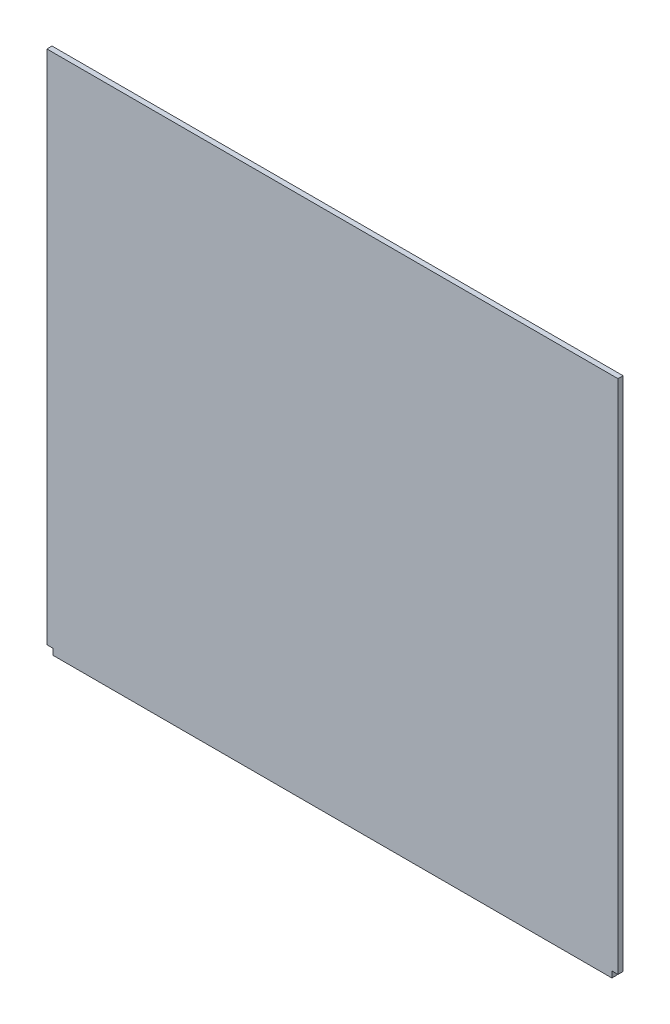
ISO-10303-21;
HEADER;
FILE_DESCRIPTION(('STEP AP214'),'2;1');
FILE_NAME('part.step','',(''),(''),'','','');
FILE_SCHEMA(('AUTOMOTIVE_DESIGN { 1 0 10303 214 1 1 1 1 }'));
ENDSEC;
DATA;
#1=APPLICATION_CONTEXT('core data for automotive mechanical design processes');
#2=APPLICATION_PROTOCOL_DEFINITION('international standard','automotive_design',2000,#1);
#3=PRODUCT_CONTEXT('',#1,'mechanical');
#4=PRODUCT('Part','Part','',(#3));
#5=PRODUCT_RELATED_PRODUCT_CATEGORY('part','',(#4));
#6=PRODUCT_DEFINITION_FORMATION('','',#4);
#7=PRODUCT_DEFINITION_CONTEXT('part definition',#1,'design');
#8=PRODUCT_DEFINITION('design','',#6,#7);
#9=PRODUCT_DEFINITION_SHAPE('','',#8);
#10=(LENGTH_UNIT() NAMED_UNIT(*) SI_UNIT(.MILLI.,.METRE.));
#11=(NAMED_UNIT(*) PLANE_ANGLE_UNIT() SI_UNIT($,.RADIAN.));
#12=(NAMED_UNIT(*) SI_UNIT($,.STERADIAN.) SOLID_ANGLE_UNIT());
#13=UNCERTAINTY_MEASURE_WITH_UNIT(LENGTH_MEASURE(1.E-05),#10,'distance_accuracy_value','');
#14=(GEOMETRIC_REPRESENTATION_CONTEXT(3) GLOBAL_UNCERTAINTY_ASSIGNED_CONTEXT((#13)) GLOBAL_UNIT_ASSIGNED_CONTEXT((#10,
#11,#12)) REPRESENTATION_CONTEXT('',''));
#15=CARTESIAN_POINT('',(0.,0.,0.));
#16=DIRECTION('',(0.,0.,1.));
#17=DIRECTION('',(1.,0.,0.));
#18=AXIS2_PLACEMENT_3D('',#15,#16,#17);
#19=CARTESIAN_POINT('',(280.,255.,0.));
#20=DIRECTION('',(0.,0.,1.));
#21=DIRECTION('',(1.,0.,0.));
#22=AXIS2_PLACEMENT_3D('',#19,#20,#21);
#23=PLANE('',#22);
#24=DIRECTION('',(1.,0.,0.));
#25=VECTOR('',#24,1.);
#26=CARTESIAN_POINT('',(0.,0.,0.));
#27=LINE('',#26,#25);
#28=CARTESIAN_POINT('',(6.00000008940697,0.,0.));
#29=VERTEX_POINT('',#28);
#30=CARTESIAN_POINT('',(554.000008255243,0.,0.));
#31=VERTEX_POINT('',#30);
#32=EDGE_CURVE('E11',#29,#31,#27,.T.);
#33=ORIENTED_EDGE('',*,*,#32,.F.);
#34=DIRECTION('',(0.,1.,0.));
#35=VECTOR('',#34,1.);
#36=CARTESIAN_POINT('',(6.00000008940697,0.,0.));
#37=LINE('',#36,#35);
#38=CARTESIAN_POINT('',(6.00000008940697,6.00000008940697,0.));
#39=VERTEX_POINT('',#38);
#40=EDGE_CURVE('E24',#29,#39,#37,.T.);
#41=ORIENTED_EDGE('',*,*,#40,.T.);
#42=DIRECTION('',(-1.,0.,0.));
#43=VECTOR('',#42,1.);
#44=CARTESIAN_POINT('',(6.00000008940697,6.00000008940697,0.));
#45=LINE('',#44,#43);
#46=CARTESIAN_POINT('',(0.,6.00000008940697,0.));
#47=VERTEX_POINT('',#46);
#48=EDGE_CURVE('E155',#39,#47,#45,.T.);
#49=ORIENTED_EDGE('',*,*,#48,.T.);
#50=DIRECTION('',(0.,1.,0.));
#51=VECTOR('',#50,1.);
#52=CARTESIAN_POINT('',(0.,510.,0.));
#53=LINE('',#52,#51);
#54=CARTESIAN_POINT('',(0.,512.,0.));
#55=VERTEX_POINT('',#54);
#56=EDGE_CURVE('E151',#47,#55,#53,.T.);
#57=ORIENTED_EDGE('',*,*,#56,.T.);
#58=DIRECTION('',(-1.,0.,0.));
#59=VECTOR('',#58,1.);
#60=CARTESIAN_POINT('',(560.,512.,0.));
#61=LINE('',#60,#59);
#62=CARTESIAN_POINT('',(560.,512.,0.));
#63=VERTEX_POINT('',#62);
#64=EDGE_CURVE('E146',#63,#55,#61,.T.);
#65=ORIENTED_EDGE('',*,*,#64,.F.);
#66=DIRECTION('',(0.,1.,0.));
#67=VECTOR('',#66,1.);
#68=CARTESIAN_POINT('',(560.,0.,0.));
#69=LINE('',#68,#67);
#70=CARTESIAN_POINT('',(560.,6.00000008940697,0.));
#71=VERTEX_POINT('',#70);
#72=EDGE_CURVE('E143',#71,#63,#69,.T.);
#73=ORIENTED_EDGE('',*,*,#72,.F.);
#74=DIRECTION('',(1.,0.,0.));
#75=VECTOR('',#74,1.);
#76=CARTESIAN_POINT('',(0.,6.00000008940697,0.));
#77=LINE('',#76,#75);
#78=CARTESIAN_POINT('',(554.000008255243,6.00000008940697,0.));
#79=VERTEX_POINT('',#78);
#80=EDGE_CURVE('E138',#79,#71,#77,.T.);
#81=ORIENTED_EDGE('',*,*,#80,.F.);
#82=DIRECTION('',(0.,1.,0.));
#83=VECTOR('',#82,1.);
#84=CARTESIAN_POINT('',(554.000008255243,0.,0.));
#85=LINE('',#84,#83);
#86=EDGE_CURVE('E94',#31,#79,#85,.T.);
#87=ORIENTED_EDGE('',*,*,#86,.F.);
#88=EDGE_LOOP('',(#33,#41,#49,#57,#65,#73,#81,#87));
#89=FACE_BOUND('',#88,.T.);
#90=ADVANCED_FACE('F16',(#89),#23,.F.);
#91=CARTESIAN_POINT('',(280.,255.,5.));
#92=DIRECTION('',(0.,0.,1.));
#93=DIRECTION('',(1.,0.,0.));
#94=AXIS2_PLACEMENT_3D('',#91,#92,#93);
#95=PLANE('',#94);
#96=DIRECTION('',(1.,0.,0.));
#97=VECTOR('',#96,1.);
#98=CARTESIAN_POINT('',(0.,0.,5.));
#99=LINE('',#98,#97);
#100=CARTESIAN_POINT('',(6.00000008940697,0.,5.));
#101=VERTEX_POINT('',#100);
#102=CARTESIAN_POINT('',(554.000008255243,0.,5.));
#103=VERTEX_POINT('',#102);
#104=EDGE_CURVE('E79',#101,#103,#99,.T.);
#105=ORIENTED_EDGE('',*,*,#104,.T.);
#106=DIRECTION('',(0.,1.,0.));
#107=VECTOR('',#106,1.);
#108=CARTESIAN_POINT('',(554.000008255243,0.,5.));
#109=LINE('',#108,#107);
#110=CARTESIAN_POINT('',(554.000008255243,6.00000008940697,5.));
#111=VERTEX_POINT('',#110);
#112=EDGE_CURVE('E95',#103,#111,#109,.T.);
#113=ORIENTED_EDGE('',*,*,#112,.T.);
#114=DIRECTION('',(1.,0.,0.));
#115=VECTOR('',#114,1.);
#116=CARTESIAN_POINT('',(280.,6.00000008940696,5.));
#117=LINE('',#116,#115);
#118=CARTESIAN_POINT('',(560.,6.00000008940697,5.));
#119=VERTEX_POINT('',#118);
#120=EDGE_CURVE('E127',#111,#119,#117,.T.);
#121=ORIENTED_EDGE('',*,*,#120,.T.);
#122=DIRECTION('',(0.,1.,0.));
#123=VECTOR('',#122,1.);
#124=CARTESIAN_POINT('',(560.,0.,5.));
#125=LINE('',#124,#123);
#126=CARTESIAN_POINT('',(560.,512.,5.));
#127=VERTEX_POINT('',#126);
#128=EDGE_CURVE('E123',#119,#127,#125,.T.);
#129=ORIENTED_EDGE('',*,*,#128,.T.);
#130=DIRECTION('',(1.,0.,0.));
#131=VECTOR('',#130,1.);
#132=CARTESIAN_POINT('',(560.,512.,5.));
#133=LINE('',#132,#131);
#134=CARTESIAN_POINT('',(0.,512.,5.));
#135=VERTEX_POINT('',#134);
#136=EDGE_CURVE('E118',#135,#127,#133,.T.);
#137=ORIENTED_EDGE('',*,*,#136,.F.);
#138=DIRECTION('',(0.,1.,0.));
#139=VECTOR('',#138,1.);
#140=CARTESIAN_POINT('',(0.,510.,5.));
#141=LINE('',#140,#139);
#142=CARTESIAN_POINT('',(0.,6.00000008940697,5.));
#143=VERTEX_POINT('',#142);
#144=EDGE_CURVE('E113',#143,#135,#141,.T.);
#145=ORIENTED_EDGE('',*,*,#144,.F.);
#146=DIRECTION('',(1.,0.,0.));
#147=VECTOR('',#146,1.);
#148=CARTESIAN_POINT('',(6.00000008940697,6.00000008940697,5.));
#149=LINE('',#148,#147);
#150=CARTESIAN_POINT('',(6.00000008940697,6.00000008940697,5.));
#151=VERTEX_POINT('',#150);
#152=EDGE_CURVE('E82',#143,#151,#149,.T.);
#153=ORIENTED_EDGE('',*,*,#152,.T.);
#154=DIRECTION('',(0.,-1.,0.));
#155=VECTOR('',#154,1.);
#156=CARTESIAN_POINT('',(6.00000008940697,0.,5.));
#157=LINE('',#156,#155);
#158=EDGE_CURVE('E76',#151,#101,#157,.T.);
#159=ORIENTED_EDGE('',*,*,#158,.T.);
#160=EDGE_LOOP('',(#105,#113,#121,#129,#137,#145,#153,#159));
#161=FACE_BOUND('',#160,.T.);
#162=ADVANCED_FACE('F78',(#161),#95,.T.);
#163=CARTESIAN_POINT('',(6.00000008940697,0.,0.));
#164=DIRECTION('',(0.,-1.,0.));
#165=DIRECTION('',(1.,0.,0.));
#166=AXIS2_PLACEMENT_3D('',#163,#164,#165);
#167=PLANE('',#166);
#168=ORIENTED_EDGE('',*,*,#32,.T.);
#169=DIRECTION('',(0.,0.,1.));
#170=VECTOR('',#169,1.);
#171=CARTESIAN_POINT('',(554.000008255243,0.,0.));
#172=LINE('',#171,#170);
#173=EDGE_CURVE('E87',#31,#103,#172,.T.);
#174=ORIENTED_EDGE('',*,*,#173,.T.);
#175=ORIENTED_EDGE('',*,*,#104,.F.);
#176=DIRECTION('',(0.,0.,1.));
#177=VECTOR('',#176,1.);
#178=CARTESIAN_POINT('',(6.00000008940697,0.,0.));
#179=LINE('',#178,#177);
#180=EDGE_CURVE('E91',#29,#101,#179,.T.);
#181=ORIENTED_EDGE('',*,*,#180,.F.);
#182=EDGE_LOOP('',(#168,#174,#175,#181));
#183=FACE_BOUND('',#182,.T.);
#184=ADVANCED_FACE('F90',(#183),#167,.T.);
#185=CARTESIAN_POINT('',(554.000008255243,0.,0.));
#186=DIRECTION('',(1.,0.,0.));
#187=DIRECTION('',(0.,1.,0.));
#188=AXIS2_PLACEMENT_3D('',#185,#186,#187);
#189=PLANE('',#188);
#190=ORIENTED_EDGE('',*,*,#86,.T.);
#191=DIRECTION('',(0.,0.,1.));
#192=VECTOR('',#191,1.);
#193=CARTESIAN_POINT('',(554.000008255243,6.00000008940697,0.));
#194=LINE('',#193,#192);
#195=EDGE_CURVE('E98',#79,#111,#194,.T.);
#196=ORIENTED_EDGE('',*,*,#195,.T.);
#197=ORIENTED_EDGE('',*,*,#112,.F.);
#198=ORIENTED_EDGE('',*,*,#173,.F.);
#199=EDGE_LOOP('',(#190,#196,#197,#198));
#200=FACE_BOUND('',#199,.T.);
#201=ADVANCED_FACE('F197',(#200),#189,.T.);
#202=CARTESIAN_POINT('',(0.,6.00000008940697,0.));
#203=DIRECTION('',(0.,-1.,0.));
#204=DIRECTION('',(1.,0.,0.));
#205=AXIS2_PLACEMENT_3D('',#202,#203,#204);
#206=PLANE('',#205);
#207=ORIENTED_EDGE('',*,*,#80,.T.);
#208=DIRECTION('',(0.,0.,1.));
#209=VECTOR('',#208,1.);
#210=CARTESIAN_POINT('',(560.,6.00000008940697,0.));
#211=LINE('',#210,#209);
#212=EDGE_CURVE('E102',#71,#119,#211,.T.);
#213=ORIENTED_EDGE('',*,*,#212,.T.);
#214=ORIENTED_EDGE('',*,*,#120,.F.);
#215=ORIENTED_EDGE('',*,*,#195,.F.);
#216=EDGE_LOOP('',(#207,#213,#214,#215));
#217=FACE_BOUND('',#216,.T.);
#218=ADVANCED_FACE('F191',(#217),#206,.T.);
#219=CARTESIAN_POINT('',(560.,6.00000008940697,0.));
#220=DIRECTION('',(1.,0.,0.));
#221=DIRECTION('',(0.,1.,0.));
#222=AXIS2_PLACEMENT_3D('',#219,#220,#221);
#223=PLANE('',#222);
#224=ORIENTED_EDGE('',*,*,#72,.T.);
#225=DIRECTION('',(0.,0.,-1.));
#226=VECTOR('',#225,1.);
#227=CARTESIAN_POINT('',(560.,512.,0.));
#228=LINE('',#227,#226);
#229=EDGE_CURVE('E174',#127,#63,#228,.T.);
#230=ORIENTED_EDGE('',*,*,#229,.F.);
#231=ORIENTED_EDGE('',*,*,#128,.F.);
#232=ORIENTED_EDGE('',*,*,#212,.F.);
#233=EDGE_LOOP('',(#224,#230,#231,#232));
#234=FACE_BOUND('',#233,.T.);
#235=ADVANCED_FACE('F195',(#234),#223,.T.);
#236=CARTESIAN_POINT('',(0.,510.,0.));
#237=DIRECTION('',(-1.,0.,0.));
#238=DIRECTION('',(0.,-1.,0.));
#239=AXIS2_PLACEMENT_3D('',#236,#237,#238);
#240=PLANE('',#239);
#241=ORIENTED_EDGE('',*,*,#56,.F.);
#242=DIRECTION('',(0.,0.,1.));
#243=VECTOR('',#242,1.);
#244=CARTESIAN_POINT('',(0.,6.00000008940697,0.));
#245=LINE('',#244,#243);
#246=EDGE_CURVE('E170',#47,#143,#245,.T.);
#247=ORIENTED_EDGE('',*,*,#246,.T.);
#248=ORIENTED_EDGE('',*,*,#144,.T.);
#249=DIRECTION('',(0.,0.,1.));
#250=VECTOR('',#249,1.);
#251=CARTESIAN_POINT('',(0.,512.,0.));
#252=LINE('',#251,#250);
#253=EDGE_CURVE('E172',#55,#135,#252,.T.);
#254=ORIENTED_EDGE('',*,*,#253,.F.);
#255=EDGE_LOOP('',(#241,#247,#248,#254));
#256=FACE_BOUND('',#255,.T.);
#257=ADVANCED_FACE('F169',(#256),#240,.T.);
#258=ORIENTED_EDGE('',*,*,#48,.F.);
#259=DIRECTION('',(0.,0.,1.));
#260=VECTOR('',#259,1.);
#261=CARTESIAN_POINT('',(6.00000008940697,6.00000008940697,0.));
#262=LINE('',#261,#260);
#263=EDGE_CURVE('E178',#39,#151,#262,.T.);
#264=ORIENTED_EDGE('',*,*,#263,.T.);
#265=ORIENTED_EDGE('',*,*,#152,.F.);
#266=ORIENTED_EDGE('',*,*,#246,.F.);
#267=EDGE_LOOP('',(#258,#264,#265,#266));
#268=FACE_BOUND('',#267,.T.);
#269=ADVANCED_FACE('F173',(#268),#206,.T.);
#270=CARTESIAN_POINT('',(6.00000008940697,6.00000008940697,0.));
#271=DIRECTION('',(-1.,0.,0.));
#272=DIRECTION('',(0.,-1.,0.));
#273=AXIS2_PLACEMENT_3D('',#270,#271,#272);
#274=PLANE('',#273);
#275=ORIENTED_EDGE('',*,*,#40,.F.);
#276=ORIENTED_EDGE('',*,*,#180,.T.);
#277=ORIENTED_EDGE('',*,*,#158,.F.);
#278=ORIENTED_EDGE('',*,*,#263,.F.);
#279=EDGE_LOOP('',(#275,#276,#277,#278));
#280=FACE_BOUND('',#279,.T.);
#281=ADVANCED_FACE('F97',(#280),#274,.T.);
#282=CARTESIAN_POINT('',(560.,512.,0.));
#283=DIRECTION('',(0.,1.,0.));
#284=DIRECTION('',(0.,0.,1.));
#285=AXIS2_PLACEMENT_3D('',#282,#283,#284);
#286=PLANE('',#285);
#287=ORIENTED_EDGE('',*,*,#64,.T.);
#288=ORIENTED_EDGE('',*,*,#253,.T.);
#289=ORIENTED_EDGE('',*,*,#136,.T.);
#290=ORIENTED_EDGE('',*,*,#229,.T.);
#291=EDGE_LOOP('',(#287,#288,#289,#290));
#292=FACE_BOUND('',#291,.T.);
#293=ADVANCED_FACE('F199',(#292),#286,.T.);
#294=CLOSED_SHELL('',(#90,#162,#184,#201,#218,#235,#257,#269,#281,#293));
#295=MANIFOLD_SOLID_BREP('B1',#294);
#296=ADVANCED_BREP_SHAPE_REPRESENTATION('',(#18,#295),#14);
#297=SHAPE_DEFINITION_REPRESENTATION(#9,#296);
ENDSEC;
END-ISO-10303-21;
